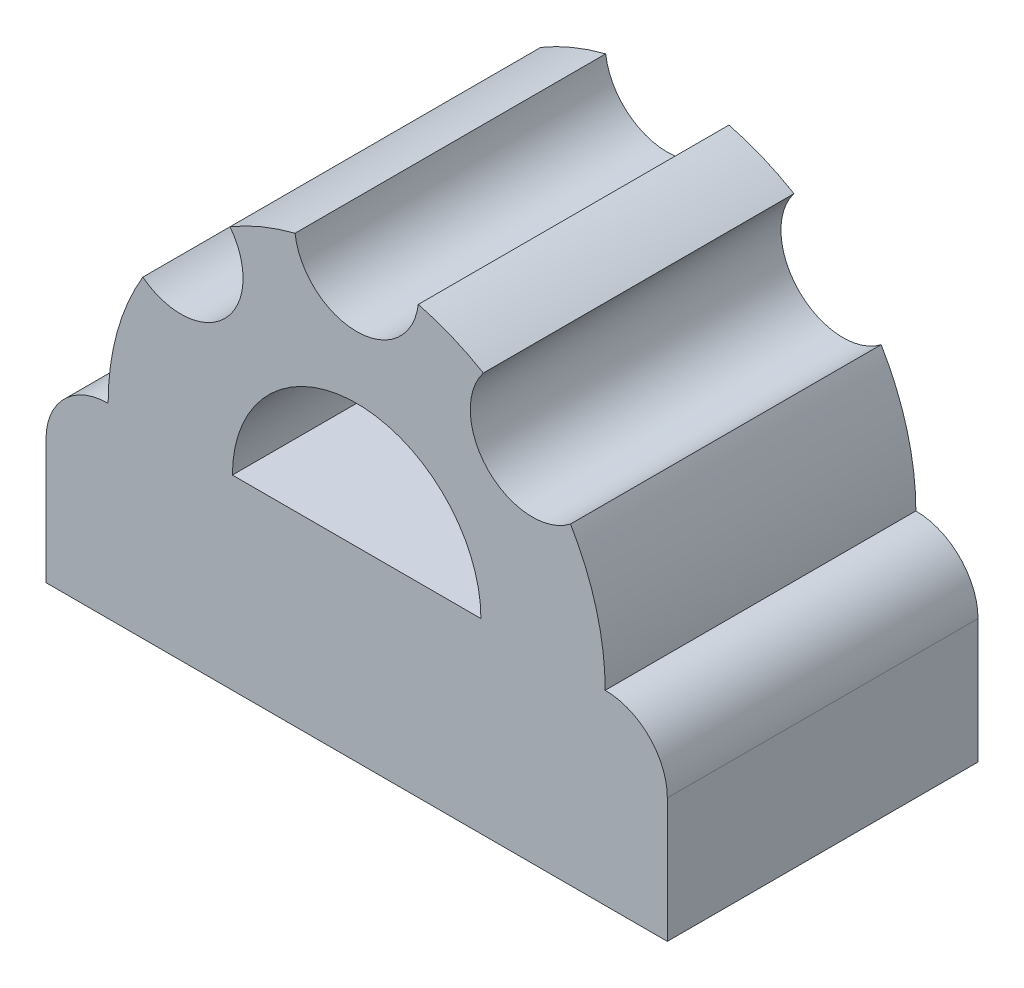
ISO-10303-21;
HEADER;
FILE_DESCRIPTION(('STEP AP214'),'2;1');
FILE_NAME('part.step','',(''),(''),'','','');
FILE_SCHEMA(('AUTOMOTIVE_DESIGN { 1 0 10303 214 1 1 1 1 }'));
ENDSEC;
DATA;
#1=APPLICATION_CONTEXT('core data for automotive mechanical design processes');
#2=APPLICATION_PROTOCOL_DEFINITION('international standard','automotive_design',2000,#1);
#3=PRODUCT_CONTEXT('',#1,'mechanical');
#4=PRODUCT('Part','Part','',(#3));
#5=PRODUCT_RELATED_PRODUCT_CATEGORY('part','',(#4));
#6=PRODUCT_DEFINITION_FORMATION('','',#4);
#7=PRODUCT_DEFINITION_CONTEXT('part definition',#1,'design');
#8=PRODUCT_DEFINITION('design','',#6,#7);
#9=PRODUCT_DEFINITION_SHAPE('','',#8);
#10=(LENGTH_UNIT() NAMED_UNIT(*) SI_UNIT(.MILLI.,.METRE.));
#11=(NAMED_UNIT(*) PLANE_ANGLE_UNIT() SI_UNIT($,.RADIAN.));
#12=(NAMED_UNIT(*) SI_UNIT($,.STERADIAN.) SOLID_ANGLE_UNIT());
#13=UNCERTAINTY_MEASURE_WITH_UNIT(LENGTH_MEASURE(1.E-05),#10,'distance_accuracy_value','');
#14=(GEOMETRIC_REPRESENTATION_CONTEXT(3) GLOBAL_UNCERTAINTY_ASSIGNED_CONTEXT((#13)) GLOBAL_UNIT_ASSIGNED_CONTEXT((#10,
#11,#12)) REPRESENTATION_CONTEXT('',''));
#15=CARTESIAN_POINT('',(0.,0.,0.));
#16=DIRECTION('',(0.,0.,1.));
#17=DIRECTION('',(1.,0.,0.));
#18=AXIS2_PLACEMENT_3D('',#15,#16,#17);
#19=CARTESIAN_POINT('',(-5.,3.,5.));
#20=DIRECTION('',(0.,0.,-1.));
#21=DIRECTION('',(-1.,0.,0.));
#22=AXIS2_PLACEMENT_3D('',#19,#20,#21);
#23=CYLINDRICAL_SURFACE('',#22,4.);
#24=CARTESIAN_POINT('',(-5.,3.,0.));
#25=DIRECTION('',(0.,0.,1.));
#26=DIRECTION('',(1.,0.,0.));
#27=AXIS2_PLACEMENT_3D('',#24,#25,#26);
#28=CIRCLE('',#27,4.);
#29=CARTESIAN_POINT('',(-5.99215674164922,6.875,0.));
#30=VERTEX_POINT('',#29);
#31=CARTESIAN_POINT('',(-7.03847801707777,6.44159953711798,0.));
#32=VERTEX_POINT('',#31);
#33=EDGE_CURVE('E176',#30,#32,#28,.T.);
#34=ORIENTED_EDGE('',*,*,#33,.T.);
#35=DIRECTION('',(0.,0.,1.));
#36=VECTOR('',#35,1.);
#37=CARTESIAN_POINT('',(-7.03847801707777,6.44159953711798,2.5));
#38=LINE('',#37,#36);
#39=CARTESIAN_POINT('',(-7.03847801707777,6.44159953711798,5.));
#40=VERTEX_POINT('',#39);
#41=EDGE_CURVE('E261',#32,#40,#38,.T.);
#42=ORIENTED_EDGE('',*,*,#41,.T.);
#43=CARTESIAN_POINT('',(-5.,3.,5.));
#44=DIRECTION('',(0.,0.,1.));
#45=DIRECTION('',(1.,0.,0.));
#46=AXIS2_PLACEMENT_3D('',#43,#44,#45);
#47=CIRCLE('',#46,4.);
#48=CARTESIAN_POINT('',(-5.99215674164922,6.875,5.));
#49=VERTEX_POINT('',#48);
#50=EDGE_CURVE('E307',#49,#40,#47,.T.);
#51=ORIENTED_EDGE('',*,*,#50,.F.);
#52=DIRECTION('',(0.,0.,1.));
#53=VECTOR('',#52,1.);
#54=CARTESIAN_POINT('',(-5.99215674164922,6.875,2.5));
#55=LINE('',#54,#53);
#56=EDGE_CURVE('E286',#49,#30,#55,.F.);
#57=ORIENTED_EDGE('',*,*,#56,.T.);
#58=EDGE_LOOP('',(#34,#42,#51,#57));
#59=FACE_BOUND('',#58,.T.);
#60=ADVANCED_FACE('F41',(#59),#23,.T.);
#61=CARTESIAN_POINT('',(-2.96152198292225,6.44159953711799,0.));
#62=VERTEX_POINT('',#61);
#63=CARTESIAN_POINT('',(-4.00784325835078,6.875,0.));
#64=VERTEX_POINT('',#63);
#65=EDGE_CURVE('E164',#62,#64,#28,.T.);
#66=ORIENTED_EDGE('',*,*,#65,.T.);
#67=DIRECTION('',(0.,0.,1.));
#68=VECTOR('',#67,1.);
#69=CARTESIAN_POINT('',(-4.00784325835078,6.875,2.5));
#70=LINE('',#69,#68);
#71=CARTESIAN_POINT('',(-4.00784325835078,6.875,5.));
#72=VERTEX_POINT('',#71);
#73=EDGE_CURVE('E283',#64,#72,#70,.T.);
#74=ORIENTED_EDGE('',*,*,#73,.T.);
#75=CARTESIAN_POINT('',(-2.96152198292225,6.44159953711799,5.));
#76=VERTEX_POINT('',#75);
#77=EDGE_CURVE('E166',#76,#72,#47,.T.);
#78=ORIENTED_EDGE('',*,*,#77,.F.);
#79=DIRECTION('',(0.,0.,1.));
#80=VECTOR('',#79,1.);
#81=CARTESIAN_POINT('',(-2.96152198292225,6.44159953711799,2.5));
#82=LINE('',#81,#80);
#83=EDGE_CURVE('E148',#76,#62,#82,.F.);
#84=ORIENTED_EDGE('',*,*,#83,.T.);
#85=EDGE_LOOP('',(#66,#74,#78,#84));
#86=FACE_BOUND('',#85,.T.);
#87=ADVANCED_FACE('F162',(#86),#23,.T.);
#88=CARTESIAN_POINT('',(-1.,3.,0.));
#89=VERTEX_POINT('',#88);
#90=CARTESIAN_POINT('',(-1.55840046288202,5.03847801707777,0.));
#91=VERTEX_POINT('',#90);
#92=EDGE_CURVE('E175',#89,#91,#28,.T.);
#93=ORIENTED_EDGE('',*,*,#92,.T.);
#94=DIRECTION('',(0.,0.,1.));
#95=VECTOR('',#94,1.);
#96=CARTESIAN_POINT('',(-1.55840046288202,5.03847801707776,2.5));
#97=LINE('',#96,#95);
#98=CARTESIAN_POINT('',(-1.55840046288202,5.03847801707776,5.));
#99=VERTEX_POINT('',#98);
#100=EDGE_CURVE('E151',#91,#99,#97,.T.);
#101=ORIENTED_EDGE('',*,*,#100,.T.);
#102=CARTESIAN_POINT('',(-1.,3.,5.));
#103=VERTEX_POINT('',#102);
#104=EDGE_CURVE('E231',#103,#99,#47,.T.);
#105=ORIENTED_EDGE('',*,*,#104,.F.);
#106=DIRECTION('',(0.,0.,-1.));
#107=VECTOR('',#106,1.);
#108=CARTESIAN_POINT('',(-1.,3.,5.));
#109=LINE('',#108,#107);
#110=EDGE_CURVE('E199',#103,#89,#109,.T.);
#111=ORIENTED_EDGE('',*,*,#110,.T.);
#112=EDGE_LOOP('',(#93,#101,#105,#111));
#113=FACE_BOUND('',#112,.T.);
#114=ADVANCED_FACE('F237',(#113),#23,.T.);
#115=CARTESIAN_POINT('',(0.,0.,5.));
#116=DIRECTION('',(0.,-1.,0.));
#117=DIRECTION('',(1.,0.,0.));
#118=AXIS2_PLACEMENT_3D('',#115,#116,#117);
#119=PLANE('',#118);
#120=DIRECTION('',(-1.,0.,0.));
#121=VECTOR('',#120,1.);
#122=CARTESIAN_POINT('',(0.,0.,0.));
#123=LINE('',#122,#121);
#124=CARTESIAN_POINT('',(0.,0.,0.));
#125=VERTEX_POINT('',#124);
#126=CARTESIAN_POINT('',(-10.,0.,0.));
#127=VERTEX_POINT('',#126);
#128=EDGE_CURVE('E247',#125,#127,#123,.T.);
#129=ORIENTED_EDGE('',*,*,#128,.F.);
#130=DIRECTION('',(0.,0.,-1.));
#131=VECTOR('',#130,1.);
#132=CARTESIAN_POINT('',(0.,0.,5.));
#133=LINE('',#132,#131);
#134=CARTESIAN_POINT('',(0.,0.,5.));
#135=VERTEX_POINT('',#134);
#136=EDGE_CURVE('E203',#135,#125,#133,.T.);
#137=ORIENTED_EDGE('',*,*,#136,.F.);
#138=DIRECTION('',(-1.,0.,0.));
#139=VECTOR('',#138,1.);
#140=CARTESIAN_POINT('',(0.,0.,5.));
#141=LINE('',#140,#139);
#142=CARTESIAN_POINT('',(-10.,0.,5.));
#143=VERTEX_POINT('',#142);
#144=EDGE_CURVE('E266',#135,#143,#141,.T.);
#145=ORIENTED_EDGE('',*,*,#144,.T.);
#146=DIRECTION('',(0.,0.,-1.));
#147=VECTOR('',#146,1.);
#148=CARTESIAN_POINT('',(-10.,0.,5.));
#149=LINE('',#148,#147);
#150=EDGE_CURVE('E191',#143,#127,#149,.T.);
#151=ORIENTED_EDGE('',*,*,#150,.T.);
#152=EDGE_LOOP('',(#129,#137,#145,#151));
#153=FACE_BOUND('',#152,.T.);
#154=ADVANCED_FACE('F321',(#153),#119,.T.);
#155=CARTESIAN_POINT('',(0.,0.,5.));
#156=DIRECTION('',(-1.,0.,0.));
#157=DIRECTION('',(0.,0.,1.));
#158=AXIS2_PLACEMENT_3D('',#155,#156,#157);
#159=PLANE('',#158);
#160=DIRECTION('',(0.,1.,0.));
#161=VECTOR('',#160,1.);
#162=CARTESIAN_POINT('',(0.,0.,0.));
#163=LINE('',#162,#161);
#164=CARTESIAN_POINT('',(0.,2.,0.));
#165=VERTEX_POINT('',#164);
#166=EDGE_CURVE('E185',#125,#165,#163,.T.);
#167=ORIENTED_EDGE('',*,*,#166,.T.);
#168=DIRECTION('',(0.,0.,-1.));
#169=VECTOR('',#168,1.);
#170=CARTESIAN_POINT('',(0.,2.,5.));
#171=LINE('',#170,#169);
#172=CARTESIAN_POINT('',(0.,2.,5.));
#173=VERTEX_POINT('',#172);
#174=EDGE_CURVE('E65',#165,#173,#171,.F.);
#175=ORIENTED_EDGE('',*,*,#174,.T.);
#176=DIRECTION('',(0.,1.,0.));
#177=VECTOR('',#176,1.);
#178=CARTESIAN_POINT('',(0.,0.,5.));
#179=LINE('',#178,#177);
#180=EDGE_CURVE('E233',#135,#173,#179,.T.);
#181=ORIENTED_EDGE('',*,*,#180,.F.);
#182=ORIENTED_EDGE('',*,*,#136,.T.);
#183=EDGE_LOOP('',(#167,#175,#181,#182));
#184=FACE_BOUND('',#183,.T.);
#185=ADVANCED_FACE('F245',(#184),#159,.F.);
#186=CARTESIAN_POINT('',(-8.44159953711799,5.03847801707775,5.));
#187=VERTEX_POINT('',#186);
#188=CARTESIAN_POINT('',(-9.,3.,5.));
#189=VERTEX_POINT('',#188);
#190=EDGE_CURVE('E240',#187,#189,#47,.T.);
#191=ORIENTED_EDGE('',*,*,#190,.F.);
#192=DIRECTION('',(0.,0.,1.));
#193=VECTOR('',#192,1.);
#194=CARTESIAN_POINT('',(-8.44159953711799,5.03847801707775,2.5));
#195=LINE('',#194,#193);
#196=CARTESIAN_POINT('',(-8.44159953711799,5.03847801707775,0.));
#197=VERTEX_POINT('',#196);
#198=EDGE_CURVE('E279',#187,#197,#195,.F.);
#199=ORIENTED_EDGE('',*,*,#198,.T.);
#200=CARTESIAN_POINT('',(-9.,3.,0.));
#201=VERTEX_POINT('',#200);
#202=EDGE_CURVE('E181',#197,#201,#28,.T.);
#203=ORIENTED_EDGE('',*,*,#202,.T.);
#204=DIRECTION('',(0.,0.,-1.));
#205=VECTOR('',#204,1.);
#206=CARTESIAN_POINT('',(-9.,3.,5.));
#207=LINE('',#206,#205);
#208=EDGE_CURVE('E194',#189,#201,#207,.T.);
#209=ORIENTED_EDGE('',*,*,#208,.F.);
#210=EDGE_LOOP('',(#191,#199,#203,#209));
#211=FACE_BOUND('',#210,.T.);
#212=ADVANCED_FACE('F314',(#211),#23,.T.);
#213=CARTESIAN_POINT('',(-5.,3.,5.));
#214=DIRECTION('',(0.,0.,-1.));
#215=DIRECTION('',(-1.,0.,0.));
#216=AXIS2_PLACEMENT_3D('',#213,#214,#215);
#217=CYLINDRICAL_SURFACE('',#216,2.);
#218=CARTESIAN_POINT('',(-5.,3.,0.));
#219=DIRECTION('',(0.,0.,1.));
#220=DIRECTION('',(1.,0.,0.));
#221=AXIS2_PLACEMENT_3D('',#218,#219,#220);
#222=CIRCLE('',#221,2.);
#223=CARTESIAN_POINT('',(-3.,3.,0.));
#224=VERTEX_POINT('',#223);
#225=CARTESIAN_POINT('',(-7.,3.,0.));
#226=VERTEX_POINT('',#225);
#227=EDGE_CURVE('E255',#224,#226,#222,.T.);
#228=ORIENTED_EDGE('',*,*,#227,.F.);
#229=DIRECTION('',(0.,0.,-1.));
#230=VECTOR('',#229,1.);
#231=CARTESIAN_POINT('',(-3.,3.,5.));
#232=LINE('',#231,#230);
#233=CARTESIAN_POINT('',(-3.,3.,5.));
#234=VERTEX_POINT('',#233);
#235=EDGE_CURVE('E195',#234,#224,#232,.T.);
#236=ORIENTED_EDGE('',*,*,#235,.F.);
#237=CARTESIAN_POINT('',(-5.,3.,5.));
#238=DIRECTION('',(0.,0.,1.));
#239=DIRECTION('',(1.,0.,0.));
#240=AXIS2_PLACEMENT_3D('',#237,#238,#239);
#241=CIRCLE('',#240,2.);
#242=CARTESIAN_POINT('',(-7.,3.,5.));
#243=VERTEX_POINT('',#242);
#244=EDGE_CURVE('E190',#234,#243,#241,.T.);
#245=ORIENTED_EDGE('',*,*,#244,.T.);
#246=DIRECTION('',(0.,0.,-1.));
#247=VECTOR('',#246,1.);
#248=CARTESIAN_POINT('',(-7.,3.,5.));
#249=LINE('',#248,#247);
#250=EDGE_CURVE('E207',#243,#226,#249,.T.);
#251=ORIENTED_EDGE('',*,*,#250,.T.);
#252=EDGE_LOOP('',(#228,#236,#245,#251));
#253=FACE_BOUND('',#252,.T.);
#254=ADVANCED_FACE('F337',(#253),#217,.F.);
#255=CARTESIAN_POINT('',(0.,3.,5.));
#256=DIRECTION('',(0.,-1.,0.));
#257=DIRECTION('',(1.,0.,0.));
#258=AXIS2_PLACEMENT_3D('',#255,#256,#257);
#259=PLANE('',#258);
#260=DIRECTION('',(-1.,0.,0.));
#261=VECTOR('',#260,1.);
#262=CARTESIAN_POINT('',(0.,3.,0.));
#263=LINE('',#262,#261);
#264=EDGE_CURVE('E251',#224,#226,#263,.T.);
#265=ORIENTED_EDGE('',*,*,#264,.T.);
#266=ORIENTED_EDGE('',*,*,#250,.F.);
#267=DIRECTION('',(-1.,0.,0.));
#268=VECTOR('',#267,1.);
#269=CARTESIAN_POINT('',(0.,3.,5.));
#270=LINE('',#269,#268);
#271=EDGE_CURVE('E270',#234,#243,#270,.T.);
#272=ORIENTED_EDGE('',*,*,#271,.F.);
#273=ORIENTED_EDGE('',*,*,#235,.T.);
#274=EDGE_LOOP('',(#265,#266,#272,#273));
#275=FACE_BOUND('',#274,.T.);
#276=ADVANCED_FACE('F341',(#275),#259,.F.);
#277=CARTESIAN_POINT('',(-10.,0.,5.));
#278=DIRECTION('',(-1.,0.,0.));
#279=DIRECTION('',(0.,0.,1.));
#280=AXIS2_PLACEMENT_3D('',#277,#278,#279);
#281=PLANE('',#280);
#282=DIRECTION('',(0.,1.,0.));
#283=VECTOR('',#282,1.);
#284=CARTESIAN_POINT('',(-10.,0.,5.));
#285=LINE('',#284,#283);
#286=CARTESIAN_POINT('',(-10.,2.,5.));
#287=VERTEX_POINT('',#286);
#288=EDGE_CURVE('E210',#143,#287,#285,.T.);
#289=ORIENTED_EDGE('',*,*,#288,.T.);
#290=DIRECTION('',(0.,0.,-1.));
#291=VECTOR('',#290,1.);
#292=CARTESIAN_POINT('',(-10.,2.,0.));
#293=LINE('',#292,#291);
#294=CARTESIAN_POINT('',(-10.,2.,0.));
#295=VERTEX_POINT('',#294);
#296=EDGE_CURVE('E11',#287,#295,#293,.T.);
#297=ORIENTED_EDGE('',*,*,#296,.T.);
#298=DIRECTION('',(0.,1.,0.));
#299=VECTOR('',#298,1.);
#300=CARTESIAN_POINT('',(-10.,0.,0.));
#301=LINE('',#300,#299);
#302=EDGE_CURVE('E180',#127,#295,#301,.T.);
#303=ORIENTED_EDGE('',*,*,#302,.F.);
#304=ORIENTED_EDGE('',*,*,#150,.F.);
#305=EDGE_LOOP('',(#289,#297,#303,#304));
#306=FACE_BOUND('',#305,.T.);
#307=ADVANCED_FACE('F319',(#306),#281,.T.);
#308=CARTESIAN_POINT('',(0.,0.,5.));
#309=DIRECTION('',(0.,0.,1.));
#310=DIRECTION('',(1.,0.,0.));
#311=AXIS2_PLACEMENT_3D('',#308,#309,#310);
#312=PLANE('',#311);
#313=ORIENTED_EDGE('',*,*,#180,.T.);
#314=CARTESIAN_POINT('',(-1.,2.,5.));
#315=DIRECTION('',(0.,0.,1.));
#316=DIRECTION('',(1.,0.,0.));
#317=AXIS2_PLACEMENT_3D('',#314,#315,#316);
#318=CIRCLE('',#317,1.);
#319=EDGE_CURVE('E50',#173,#103,#318,.T.);
#320=ORIENTED_EDGE('',*,*,#319,.T.);
#321=ORIENTED_EDGE('',*,*,#104,.T.);
#322=CARTESIAN_POINT('',(-2.17157287525382,5.8284271247462,5.));
#323=DIRECTION('',(0.,0.,1.));
#324=DIRECTION('',(1.,0.,0.));
#325=AXIS2_PLACEMENT_3D('',#322,#323,#324);
#326=CIRCLE('',#325,1.);
#327=EDGE_CURVE('E157',#76,#99,#326,.T.);
#328=ORIENTED_EDGE('',*,*,#327,.F.);
#329=ORIENTED_EDGE('',*,*,#77,.T.);
#330=CARTESIAN_POINT('',(-5.,7.,5.));
#331=DIRECTION('',(0.,0.,1.));
#332=DIRECTION('',(1.,0.,0.));
#333=AXIS2_PLACEMENT_3D('',#330,#331,#332);
#334=CIRCLE('',#333,1.);
#335=EDGE_CURVE('E296',#49,#72,#334,.T.);
#336=ORIENTED_EDGE('',*,*,#335,.F.);
#337=ORIENTED_EDGE('',*,*,#50,.T.);
#338=CARTESIAN_POINT('',(-7.8284271247462,5.82842712474618,5.));
#339=DIRECTION('',(0.,0.,1.));
#340=DIRECTION('',(1.,0.,0.));
#341=AXIS2_PLACEMENT_3D('',#338,#339,#340);
#342=CIRCLE('',#341,1.);
#343=EDGE_CURVE('E168',#187,#40,#342,.T.);
#344=ORIENTED_EDGE('',*,*,#343,.F.);
#345=ORIENTED_EDGE('',*,*,#190,.T.);
#346=CARTESIAN_POINT('',(-9.,2.,5.));
#347=DIRECTION('',(0.,0.,1.));
#348=DIRECTION('',(1.,0.,0.));
#349=AXIS2_PLACEMENT_3D('',#346,#347,#348);
#350=CIRCLE('',#349,1.);
#351=EDGE_CURVE('E57',#189,#287,#350,.T.);
#352=ORIENTED_EDGE('',*,*,#351,.T.);
#353=ORIENTED_EDGE('',*,*,#288,.F.);
#354=ORIENTED_EDGE('',*,*,#144,.F.);
#355=EDGE_LOOP('',(#313,#320,#321,#328,#329,#336,#337,#344,#345,#352,#353,#354));
#356=FACE_BOUND('',#355,.T.);
#357=ORIENTED_EDGE('',*,*,#244,.F.);
#358=ORIENTED_EDGE('',*,*,#271,.T.);
#359=EDGE_LOOP('',(#357,#358));
#360=FACE_BOUND('',#359,.T.);
#361=ADVANCED_FACE('F229',(#356,#360),#312,.T.);
#362=CARTESIAN_POINT('',(0.,0.,0.));
#363=DIRECTION('',(0.,0.,1.));
#364=DIRECTION('',(1.,0.,0.));
#365=AXIS2_PLACEMENT_3D('',#362,#363,#364);
#366=PLANE('',#365);
#367=ORIENTED_EDGE('',*,*,#227,.T.);
#368=ORIENTED_EDGE('',*,*,#264,.F.);
#369=EDGE_LOOP('',(#367,#368));
#370=FACE_BOUND('',#369,.T.);
#371=ORIENTED_EDGE('',*,*,#92,.F.);
#372=CARTESIAN_POINT('',(-1.,2.,0.));
#373=DIRECTION('',(0.,0.,1.));
#374=DIRECTION('',(1.,0.,0.));
#375=AXIS2_PLACEMENT_3D('',#372,#373,#374);
#376=CIRCLE('',#375,1.);
#377=EDGE_CURVE('E219',#89,#165,#376,.F.);
#378=ORIENTED_EDGE('',*,*,#377,.T.);
#379=ORIENTED_EDGE('',*,*,#166,.F.);
#380=ORIENTED_EDGE('',*,*,#128,.T.);
#381=ORIENTED_EDGE('',*,*,#302,.T.);
#382=CARTESIAN_POINT('',(-9.,2.,0.));
#383=DIRECTION('',(0.,0.,1.));
#384=DIRECTION('',(1.,0.,0.));
#385=AXIS2_PLACEMENT_3D('',#382,#383,#384);
#386=CIRCLE('',#385,1.);
#387=EDGE_CURVE('E216',#295,#201,#386,.F.);
#388=ORIENTED_EDGE('',*,*,#387,.T.);
#389=ORIENTED_EDGE('',*,*,#202,.F.);
#390=CARTESIAN_POINT('',(-7.8284271247462,5.82842712474618,0.));
#391=DIRECTION('',(0.,0.,1.));
#392=DIRECTION('',(1.,0.,0.));
#393=AXIS2_PLACEMENT_3D('',#390,#391,#392);
#394=CIRCLE('',#393,1.);
#395=EDGE_CURVE('E206',#197,#32,#394,.T.);
#396=ORIENTED_EDGE('',*,*,#395,.T.);
#397=ORIENTED_EDGE('',*,*,#33,.F.);
#398=CARTESIAN_POINT('',(-5.,7.,0.));
#399=DIRECTION('',(0.,0.,1.));
#400=DIRECTION('',(1.,0.,0.));
#401=AXIS2_PLACEMENT_3D('',#398,#399,#400);
#402=CIRCLE('',#401,1.);
#403=EDGE_CURVE('E173',#30,#64,#402,.T.);
#404=ORIENTED_EDGE('',*,*,#403,.T.);
#405=ORIENTED_EDGE('',*,*,#65,.F.);
#406=CARTESIAN_POINT('',(-2.17157287525382,5.8284271247462,0.));
#407=DIRECTION('',(0.,0.,1.));
#408=DIRECTION('',(1.,0.,0.));
#409=AXIS2_PLACEMENT_3D('',#406,#407,#408);
#410=CIRCLE('',#409,1.);
#411=EDGE_CURVE('E145',#62,#91,#410,.T.);
#412=ORIENTED_EDGE('',*,*,#411,.T.);
#413=EDGE_LOOP('',(#371,#378,#379,#380,#381,#388,#389,#396,#397,#404,#405,#412));
#414=FACE_BOUND('',#413,.T.);
#415=ADVANCED_FACE('F171',(#370,#414),#366,.F.);
#416=CARTESIAN_POINT('',(-2.17157287525382,5.8284271247462,0.));
#417=DIRECTION('',(0.,0.,1.));
#418=DIRECTION('',(1.,0.,0.));
#419=AXIS2_PLACEMENT_3D('',#416,#417,#418);
#420=CYLINDRICAL_SURFACE('',#419,1.);
#421=ORIENTED_EDGE('',*,*,#411,.F.);
#422=ORIENTED_EDGE('',*,*,#83,.F.);
#423=ORIENTED_EDGE('',*,*,#327,.T.);
#424=ORIENTED_EDGE('',*,*,#100,.F.);
#425=EDGE_LOOP('',(#421,#422,#423,#424));
#426=FACE_BOUND('',#425,.T.);
#427=ADVANCED_FACE('F147',(#426),#420,.F.);
#428=CARTESIAN_POINT('',(-5.,7.,0.));
#429=DIRECTION('',(0.,0.,1.));
#430=DIRECTION('',(1.,0.,0.));
#431=AXIS2_PLACEMENT_3D('',#428,#429,#430);
#432=CYLINDRICAL_SURFACE('',#431,1.);
#433=ORIENTED_EDGE('',*,*,#403,.F.);
#434=ORIENTED_EDGE('',*,*,#56,.F.);
#435=ORIENTED_EDGE('',*,*,#335,.T.);
#436=ORIENTED_EDGE('',*,*,#73,.F.);
#437=EDGE_LOOP('',(#433,#434,#435,#436));
#438=FACE_BOUND('',#437,.T.);
#439=ADVANCED_FACE('F354',(#438),#432,.F.);
#440=CARTESIAN_POINT('',(-7.8284271247462,5.82842712474618,0.));
#441=DIRECTION('',(0.,0.,1.));
#442=DIRECTION('',(1.,0.,0.));
#443=AXIS2_PLACEMENT_3D('',#440,#441,#442);
#444=CYLINDRICAL_SURFACE('',#443,1.);
#445=ORIENTED_EDGE('',*,*,#395,.F.);
#446=ORIENTED_EDGE('',*,*,#198,.F.);
#447=ORIENTED_EDGE('',*,*,#343,.T.);
#448=ORIENTED_EDGE('',*,*,#41,.F.);
#449=EDGE_LOOP('',(#445,#446,#447,#448));
#450=FACE_BOUND('',#449,.T.);
#451=ADVANCED_FACE('F302',(#450),#444,.F.);
#452=CARTESIAN_POINT('',(-1.,2.,5.));
#453=DIRECTION('',(0.,0.,-1.));
#454=DIRECTION('',(-1.,0.,0.));
#455=AXIS2_PLACEMENT_3D('',#452,#453,#454);
#456=CYLINDRICAL_SURFACE('',#455,1.);
#457=ORIENTED_EDGE('',*,*,#319,.F.);
#458=ORIENTED_EDGE('',*,*,#174,.F.);
#459=ORIENTED_EDGE('',*,*,#377,.F.);
#460=ORIENTED_EDGE('',*,*,#110,.F.);
#461=EDGE_LOOP('',(#457,#458,#459,#460));
#462=FACE_BOUND('',#461,.T.);
#463=ADVANCED_FACE('F241',(#462),#456,.T.);
#464=CARTESIAN_POINT('',(-9.,2.,5.));
#465=DIRECTION('',(0.,0.,1.));
#466=DIRECTION('',(1.,0.,0.));
#467=AXIS2_PLACEMENT_3D('',#464,#465,#466);
#468=CYLINDRICAL_SURFACE('',#467,1.);
#469=ORIENTED_EDGE('',*,*,#351,.F.);
#470=ORIENTED_EDGE('',*,*,#208,.T.);
#471=ORIENTED_EDGE('',*,*,#387,.F.);
#472=ORIENTED_EDGE('',*,*,#296,.F.);
#473=EDGE_LOOP('',(#469,#470,#471,#472));
#474=FACE_BOUND('',#473,.T.);
#475=ADVANCED_FACE('F43',(#474),#468,.T.);
#476=CLOSED_SHELL('',(#60,#87,#114,#154,#185,#212,#254,#276,#307,#361,#415,#427,#439,#451,#463,#475));
#477=MANIFOLD_SOLID_BREP('B2',#476);
#478=ADVANCED_BREP_SHAPE_REPRESENTATION('',(#18,#477),#14);
#479=SHAPE_DEFINITION_REPRESENTATION(#9,#478);
ENDSEC;
END-ISO-10303-21;
